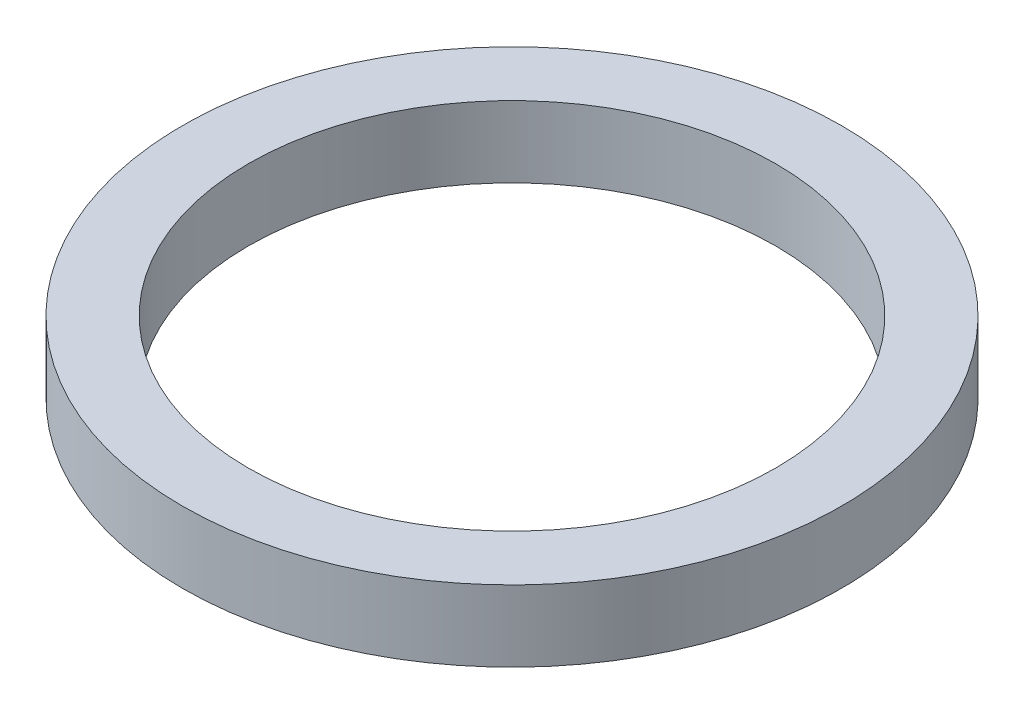
ISO-10303-21;
HEADER;
FILE_DESCRIPTION(('STEP AP214'),'2;1');
FILE_NAME('part.step','',(''),(''),'','','');
FILE_SCHEMA(('AUTOMOTIVE_DESIGN { 1 0 10303 214 1 1 1 1 }'));
ENDSEC;
DATA;
#1=APPLICATION_CONTEXT('core data for automotive mechanical design processes');
#2=APPLICATION_PROTOCOL_DEFINITION('international standard','automotive_design',2000,#1);
#3=PRODUCT_CONTEXT('',#1,'mechanical');
#4=PRODUCT('Part','Part','',(#3));
#5=PRODUCT_RELATED_PRODUCT_CATEGORY('part','',(#4));
#6=PRODUCT_DEFINITION_FORMATION('','',#4);
#7=PRODUCT_DEFINITION_CONTEXT('part definition',#1,'design');
#8=PRODUCT_DEFINITION('design','',#6,#7);
#9=PRODUCT_DEFINITION_SHAPE('','',#8);
#10=(LENGTH_UNIT() NAMED_UNIT(*) SI_UNIT(.MILLI.,.METRE.));
#11=(NAMED_UNIT(*) PLANE_ANGLE_UNIT() SI_UNIT($,.RADIAN.));
#12=(NAMED_UNIT(*) SI_UNIT($,.STERADIAN.) SOLID_ANGLE_UNIT());
#13=UNCERTAINTY_MEASURE_WITH_UNIT(LENGTH_MEASURE(1.E-05),#10,'distance_accuracy_value','');
#14=(GEOMETRIC_REPRESENTATION_CONTEXT(3) GLOBAL_UNCERTAINTY_ASSIGNED_CONTEXT((#13)) GLOBAL_UNIT_ASSIGNED_CONTEXT((#10,
#11,#12)) REPRESENTATION_CONTEXT('',''));
#15=CARTESIAN_POINT('',(0.,0.,0.));
#16=DIRECTION('',(0.,0.,1.));
#17=DIRECTION('',(1.,0.,0.));
#18=AXIS2_PLACEMENT_3D('',#15,#16,#17);
#19=CARTESIAN_POINT('',(0.,2.,0.));
#20=DIRECTION('',(0.,1.,0.));
#21=DIRECTION('',(0.,0.,1.));
#22=AXIS2_PLACEMENT_3D('',#19,#20,#21);
#23=PLANE('',#22);
#24=CARTESIAN_POINT('',(0.,2.,0.));
#25=DIRECTION('',(0.,1.,0.));
#26=DIRECTION('',(0.,0.,1.));
#27=AXIS2_PLACEMENT_3D('',#24,#25,#26);
#28=CIRCLE('',#27,9.25);
#29=CARTESIAN_POINT('',(0.,2.,9.25));
#30=VERTEX_POINT('',#29);
#31=EDGE_CURVE('E10',#30,#30,#28,.T.);
#32=ORIENTED_EDGE('',*,*,#31,.T.);
#33=EDGE_LOOP('',(#32));
#34=FACE_BOUND('',#33,.T.);
#35=CARTESIAN_POINT('',(0.,2.,0.));
#36=DIRECTION('',(0.,1.,0.));
#37=DIRECTION('',(0.,0.,1.));
#38=AXIS2_PLACEMENT_3D('',#35,#36,#37);
#39=CIRCLE('',#38,7.4);
#40=CARTESIAN_POINT('',(0.,2.,7.4));
#41=VERTEX_POINT('',#40);
#42=EDGE_CURVE('E53',#41,#41,#39,.T.);
#43=ORIENTED_EDGE('',*,*,#42,.F.);
#44=EDGE_LOOP('',(#43));
#45=FACE_BOUND('',#44,.T.);
#46=ADVANCED_FACE('F41',(#34,#45),#23,.T.);
#47=CARTESIAN_POINT('',(0.,0.,0.));
#48=DIRECTION('',(0.,1.,0.));
#49=DIRECTION('',(0.,0.,1.));
#50=AXIS2_PLACEMENT_3D('',#47,#48,#49);
#51=PLANE('',#50);
#52=CARTESIAN_POINT('',(0.,0.,0.));
#53=DIRECTION('',(0.,1.,0.));
#54=DIRECTION('',(0.,0.,1.));
#55=AXIS2_PLACEMENT_3D('',#52,#53,#54);
#56=CIRCLE('',#55,9.25);
#57=CARTESIAN_POINT('',(0.,0.,9.25));
#58=VERTEX_POINT('',#57);
#59=EDGE_CURVE('E44',#58,#58,#56,.T.);
#60=ORIENTED_EDGE('',*,*,#59,.F.);
#61=EDGE_LOOP('',(#60));
#62=FACE_BOUND('',#61,.T.);
#63=CARTESIAN_POINT('',(0.,0.,0.));
#64=DIRECTION('',(0.,1.,0.));
#65=DIRECTION('',(0.,0.,1.));
#66=AXIS2_PLACEMENT_3D('',#63,#64,#65);
#67=CIRCLE('',#66,7.4);
#68=CARTESIAN_POINT('',(0.,0.,7.4));
#69=VERTEX_POINT('',#68);
#70=EDGE_CURVE('E57',#69,#69,#67,.T.);
#71=ORIENTED_EDGE('',*,*,#70,.T.);
#72=EDGE_LOOP('',(#71));
#73=FACE_BOUND('',#72,.T.);
#74=ADVANCED_FACE('F69',(#62,#73),#51,.F.);
#75=CARTESIAN_POINT('',(0.,2.,0.));
#76=DIRECTION('',(0.,-1.,0.));
#77=DIRECTION('',(0.,0.,-1.));
#78=AXIS2_PLACEMENT_3D('',#75,#76,#77);
#79=CYLINDRICAL_SURFACE('',#78,9.25);
#80=ORIENTED_EDGE('',*,*,#31,.F.);
#81=EDGE_LOOP('',(#80));
#82=FACE_BOUND('',#81,.T.);
#83=ORIENTED_EDGE('',*,*,#59,.T.);
#84=EDGE_LOOP('',(#83));
#85=FACE_BOUND('',#84,.T.);
#86=ADVANCED_FACE('F43',(#82,#85),#79,.T.);
#87=CARTESIAN_POINT('',(0.,2.,0.));
#88=DIRECTION('',(0.,-1.,0.));
#89=DIRECTION('',(0.,0.,-1.));
#90=AXIS2_PLACEMENT_3D('',#87,#88,#89);
#91=CYLINDRICAL_SURFACE('',#90,7.4);
#92=ORIENTED_EDGE('',*,*,#42,.T.);
#93=EDGE_LOOP('',(#92));
#94=FACE_BOUND('',#93,.T.);
#95=ORIENTED_EDGE('',*,*,#70,.F.);
#96=EDGE_LOOP('',(#95));
#97=FACE_BOUND('',#96,.T.);
#98=ADVANCED_FACE('F63',(#94,#97),#91,.F.);
#99=CLOSED_SHELL('',(#46,#74,#86,#98));
#100=MANIFOLD_SOLID_BREP('B2',#99);
#101=ADVANCED_BREP_SHAPE_REPRESENTATION('',(#18,#100),#14);
#102=SHAPE_DEFINITION_REPRESENTATION(#9,#101);
ENDSEC;
END-ISO-10303-21;
